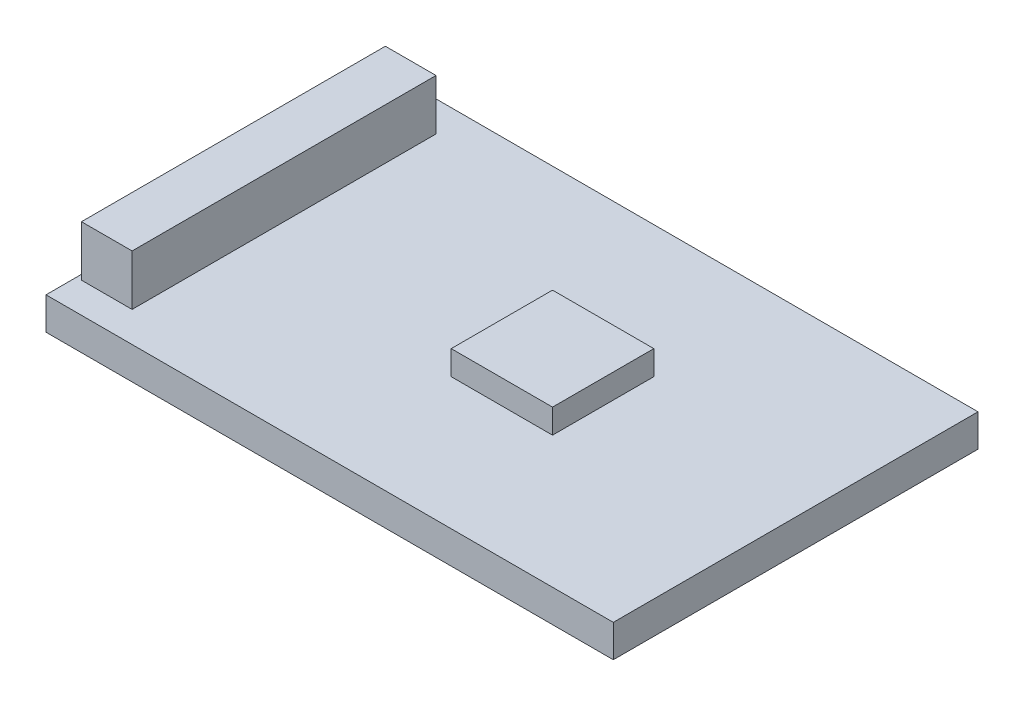
ISO-10303-21;
HEADER;
FILE_DESCRIPTION(('STEP AP214'),'2;1');
FILE_NAME('part.step','',(''),(''),'','','');
FILE_SCHEMA(('AUTOMOTIVE_DESIGN { 1 0 10303 214 1 1 1 1 }'));
ENDSEC;
DATA;
#1=APPLICATION_CONTEXT('core data for automotive mechanical design processes');
#2=APPLICATION_PROTOCOL_DEFINITION('international standard','automotive_design',2000,#1);
#3=PRODUCT_CONTEXT('',#1,'mechanical');
#4=PRODUCT('Part','Part','',(#3));
#5=PRODUCT_RELATED_PRODUCT_CATEGORY('part','',(#4));
#6=PRODUCT_DEFINITION_FORMATION('','',#4);
#7=PRODUCT_DEFINITION_CONTEXT('part definition',#1,'design');
#8=PRODUCT_DEFINITION('design','',#6,#7);
#9=PRODUCT_DEFINITION_SHAPE('','',#8);
#10=(LENGTH_UNIT() NAMED_UNIT(*) SI_UNIT(.MILLI.,.METRE.));
#11=(NAMED_UNIT(*) PLANE_ANGLE_UNIT() SI_UNIT($,.RADIAN.));
#12=(NAMED_UNIT(*) SI_UNIT($,.STERADIAN.) SOLID_ANGLE_UNIT());
#13=UNCERTAINTY_MEASURE_WITH_UNIT(LENGTH_MEASURE(1.E-05),#10,'distance_accuracy_value','');
#14=(GEOMETRIC_REPRESENTATION_CONTEXT(3) GLOBAL_UNCERTAINTY_ASSIGNED_CONTEXT((#13)) GLOBAL_UNIT_ASSIGNED_CONTEXT((#10,
#11,#12)) REPRESENTATION_CONTEXT('',''));
#15=CARTESIAN_POINT('',(0.,0.,0.));
#16=DIRECTION('',(0.,0.,1.));
#17=DIRECTION('',(1.,0.,0.));
#18=AXIS2_PLACEMENT_3D('',#15,#16,#17);
#19=CARTESIAN_POINT('',(0.,1.6,0.));
#20=DIRECTION('',(0.,-1.,0.));
#21=DIRECTION('',(0.,0.,-1.));
#22=AXIS2_PLACEMENT_3D('',#19,#20,#21);
#23=PLANE('',#22);
#24=DIRECTION('',(0.,0.,-1.));
#25=VECTOR('',#24,1.);
#26=CARTESIAN_POINT('',(4.5,1.6,2.5));
#27=LINE('',#26,#25);
#28=CARTESIAN_POINT('',(4.5,1.6,2.5));
#29=VERTEX_POINT('',#28);
#30=CARTESIAN_POINT('',(4.5,1.6,-2.5));
#31=VERTEX_POINT('',#30);
#32=EDGE_CURVE('E162',#29,#31,#27,.T.);
#33=ORIENTED_EDGE('',*,*,#32,.F.);
#34=DIRECTION('',(1.,0.,0.));
#35=VECTOR('',#34,1.);
#36=CARTESIAN_POINT('',(-0.5,1.6,2.5));
#37=LINE('',#36,#35);
#38=CARTESIAN_POINT('',(-0.5,1.6,2.5));
#39=VERTEX_POINT('',#38);
#40=EDGE_CURVE('E178',#39,#29,#37,.T.);
#41=ORIENTED_EDGE('',*,*,#40,.F.);
#42=DIRECTION('',(0.,0.,1.));
#43=VECTOR('',#42,1.);
#44=CARTESIAN_POINT('',(-0.5,1.6,2.5));
#45=LINE('',#44,#43);
#46=CARTESIAN_POINT('',(-0.5,1.6,-2.5));
#47=VERTEX_POINT('',#46);
#48=EDGE_CURVE('E192',#47,#39,#45,.T.);
#49=ORIENTED_EDGE('',*,*,#48,.F.);
#50=DIRECTION('',(-1.,0.,0.));
#51=VECTOR('',#50,1.);
#52=CARTESIAN_POINT('',(-0.5,1.6,-2.5));
#53=LINE('',#52,#51);
#54=EDGE_CURVE('E169',#31,#47,#53,.T.);
#55=ORIENTED_EDGE('',*,*,#54,.F.);
#56=EDGE_LOOP('',(#33,#41,#49,#55));
#57=FACE_BOUND('',#56,.T.);
#58=DIRECTION('',(0.,0.,-1.));
#59=VECTOR('',#58,1.);
#60=CARTESIAN_POINT('',(14.,1.6,9.));
#61=LINE('',#60,#59);
#62=CARTESIAN_POINT('',(14.,1.6,9.));
#63=VERTEX_POINT('',#62);
#64=CARTESIAN_POINT('',(14.,1.6,-9.));
#65=VERTEX_POINT('',#64);
#66=EDGE_CURVE('E214',#63,#65,#61,.T.);
#67=ORIENTED_EDGE('',*,*,#66,.T.);
#68=DIRECTION('',(-1.,0.,0.));
#69=VECTOR('',#68,1.);
#70=CARTESIAN_POINT('',(-14.,1.6,-9.));
#71=LINE('',#70,#69);
#72=CARTESIAN_POINT('',(-14.,1.6,-9.));
#73=VERTEX_POINT('',#72);
#74=EDGE_CURVE('E218',#65,#73,#71,.T.);
#75=ORIENTED_EDGE('',*,*,#74,.T.);
#76=DIRECTION('',(0.,0.,1.));
#77=VECTOR('',#76,1.);
#78=CARTESIAN_POINT('',(-14.,1.6,9.));
#79=LINE('',#78,#77);
#80=CARTESIAN_POINT('',(-14.,1.6,9.));
#81=VERTEX_POINT('',#80);
#82=EDGE_CURVE('E224',#73,#81,#79,.T.);
#83=ORIENTED_EDGE('',*,*,#82,.T.);
#84=DIRECTION('',(1.,0.,0.));
#85=VECTOR('',#84,1.);
#86=CARTESIAN_POINT('',(-14.,1.6,9.));
#87=LINE('',#86,#85);
#88=EDGE_CURVE('E226',#81,#63,#87,.T.);
#89=ORIENTED_EDGE('',*,*,#88,.T.);
#90=EDGE_LOOP('',(#67,#75,#83,#89));
#91=FACE_BOUND('',#90,.T.);
#92=DIRECTION('',(0.,0.,-1.));
#93=VECTOR('',#92,1.);
#94=CARTESIAN_POINT('',(-11.25,1.6,7.5));
#95=LINE('',#94,#93);
#96=CARTESIAN_POINT('',(-11.25,1.6,7.5));
#97=VERTEX_POINT('',#96);
#98=CARTESIAN_POINT('',(-11.25,1.6,-7.5));
#99=VERTEX_POINT('',#98);
#100=EDGE_CURVE('E161',#97,#99,#95,.T.);
#101=ORIENTED_EDGE('',*,*,#100,.F.);
#102=DIRECTION('',(1.,0.,0.));
#103=VECTOR('',#102,1.);
#104=CARTESIAN_POINT('',(-13.75,1.6,7.5));
#105=LINE('',#104,#103);
#106=CARTESIAN_POINT('',(-13.75,1.6,7.5));
#107=VERTEX_POINT('',#106);
#108=EDGE_CURVE('E158',#107,#97,#105,.T.);
#109=ORIENTED_EDGE('',*,*,#108,.F.);
#110=DIRECTION('',(0.,0.,1.));
#111=VECTOR('',#110,1.);
#112=CARTESIAN_POINT('',(-13.75,1.6,7.5));
#113=LINE('',#112,#111);
#114=CARTESIAN_POINT('',(-13.75,1.6,-7.5));
#115=VERTEX_POINT('',#114);
#116=EDGE_CURVE('E70',#115,#107,#113,.T.);
#117=ORIENTED_EDGE('',*,*,#116,.F.);
#118=DIRECTION('',(-1.,0.,0.));
#119=VECTOR('',#118,1.);
#120=CARTESIAN_POINT('',(-13.75,1.6,-7.5));
#121=LINE('',#120,#119);
#122=EDGE_CURVE('E64',#99,#115,#121,.T.);
#123=ORIENTED_EDGE('',*,*,#122,.F.);
#124=EDGE_LOOP('',(#101,#109,#117,#123));
#125=FACE_BOUND('',#124,.T.);
#126=ADVANCED_FACE('F47',(#57,#91,#125),#23,.F.);
#127=CARTESIAN_POINT('',(14.,1.6,9.));
#128=DIRECTION('',(-1.,0.,0.));
#129=DIRECTION('',(0.,0.,1.));
#130=AXIS2_PLACEMENT_3D('',#127,#128,#129);
#131=PLANE('',#130);
#132=DIRECTION('',(0.,0.,-1.));
#133=VECTOR('',#132,1.);
#134=CARTESIAN_POINT('',(14.,0.,9.));
#135=LINE('',#134,#133);
#136=CARTESIAN_POINT('',(14.,0.,9.));
#137=VERTEX_POINT('',#136);
#138=CARTESIAN_POINT('',(14.,0.,-9.));
#139=VERTEX_POINT('',#138);
#140=EDGE_CURVE('E212',#137,#139,#135,.T.);
#141=ORIENTED_EDGE('',*,*,#140,.T.);
#142=DIRECTION('',(0.,-1.,0.));
#143=VECTOR('',#142,1.);
#144=CARTESIAN_POINT('',(14.,1.6,-9.));
#145=LINE('',#144,#143);
#146=EDGE_CURVE('E11',#65,#139,#145,.T.);
#147=ORIENTED_EDGE('',*,*,#146,.F.);
#148=ORIENTED_EDGE('',*,*,#66,.F.);
#149=DIRECTION('',(0.,-1.,0.));
#150=VECTOR('',#149,1.);
#151=CARTESIAN_POINT('',(14.,1.6,9.));
#152=LINE('',#151,#150);
#153=EDGE_CURVE('E228',#63,#137,#152,.T.);
#154=ORIENTED_EDGE('',*,*,#153,.T.);
#155=EDGE_LOOP('',(#141,#147,#148,#154));
#156=FACE_BOUND('',#155,.T.);
#157=ADVANCED_FACE('F51',(#156),#131,.F.);
#158=CARTESIAN_POINT('',(-14.,1.6,-9.));
#159=DIRECTION('',(0.,0.,1.));
#160=DIRECTION('',(1.,0.,0.));
#161=AXIS2_PLACEMENT_3D('',#158,#159,#160);
#162=PLANE('',#161);
#163=DIRECTION('',(-1.,0.,0.));
#164=VECTOR('',#163,1.);
#165=CARTESIAN_POINT('',(-14.,0.,-9.));
#166=LINE('',#165,#164);
#167=CARTESIAN_POINT('',(-14.,0.,-9.));
#168=VERTEX_POINT('',#167);
#169=EDGE_CURVE('E234',#139,#168,#166,.T.);
#170=ORIENTED_EDGE('',*,*,#169,.T.);
#171=DIRECTION('',(0.,-1.,0.));
#172=VECTOR('',#171,1.);
#173=CARTESIAN_POINT('',(-14.,1.6,-9.));
#174=LINE('',#173,#172);
#175=EDGE_CURVE('E59',#73,#168,#174,.T.);
#176=ORIENTED_EDGE('',*,*,#175,.F.);
#177=ORIENTED_EDGE('',*,*,#74,.F.);
#178=ORIENTED_EDGE('',*,*,#146,.T.);
#179=EDGE_LOOP('',(#170,#176,#177,#178));
#180=FACE_BOUND('',#179,.T.);
#181=ADVANCED_FACE('F268',(#180),#162,.F.);
#182=CARTESIAN_POINT('',(-14.,1.6,9.));
#183=DIRECTION('',(1.,0.,0.));
#184=DIRECTION('',(0.,0.,-1.));
#185=AXIS2_PLACEMENT_3D('',#182,#183,#184);
#186=PLANE('',#185);
#187=DIRECTION('',(0.,0.,1.));
#188=VECTOR('',#187,1.);
#189=CARTESIAN_POINT('',(-14.,0.,9.));
#190=LINE('',#189,#188);
#191=CARTESIAN_POINT('',(-14.,0.,9.));
#192=VERTEX_POINT('',#191);
#193=EDGE_CURVE('E237',#168,#192,#190,.T.);
#194=ORIENTED_EDGE('',*,*,#193,.T.);
#195=DIRECTION('',(0.,-1.,0.));
#196=VECTOR('',#195,1.);
#197=CARTESIAN_POINT('',(-14.,1.6,9.));
#198=LINE('',#197,#196);
#199=EDGE_CURVE('E243',#81,#192,#198,.T.);
#200=ORIENTED_EDGE('',*,*,#199,.F.);
#201=ORIENTED_EDGE('',*,*,#82,.F.);
#202=ORIENTED_EDGE('',*,*,#175,.T.);
#203=EDGE_LOOP('',(#194,#200,#201,#202));
#204=FACE_BOUND('',#203,.T.);
#205=ADVANCED_FACE('F251',(#204),#186,.F.);
#206=CARTESIAN_POINT('',(-14.,1.6,9.));
#207=DIRECTION('',(0.,0.,-1.));
#208=DIRECTION('',(-1.,0.,0.));
#209=AXIS2_PLACEMENT_3D('',#206,#207,#208);
#210=PLANE('',#209);
#211=DIRECTION('',(1.,0.,0.));
#212=VECTOR('',#211,1.);
#213=CARTESIAN_POINT('',(-14.,0.,9.));
#214=LINE('',#213,#212);
#215=EDGE_CURVE('E219',#192,#137,#214,.T.);
#216=ORIENTED_EDGE('',*,*,#215,.T.);
#217=ORIENTED_EDGE('',*,*,#153,.F.);
#218=ORIENTED_EDGE('',*,*,#88,.F.);
#219=ORIENTED_EDGE('',*,*,#199,.T.);
#220=EDGE_LOOP('',(#216,#217,#218,#219));
#221=FACE_BOUND('',#220,.T.);
#222=ADVANCED_FACE('F265',(#221),#210,.F.);
#223=CARTESIAN_POINT('',(0.,0.,0.));
#224=DIRECTION('',(0.,-1.,0.));
#225=DIRECTION('',(0.,0.,-1.));
#226=AXIS2_PLACEMENT_3D('',#223,#224,#225);
#227=PLANE('',#226);
#228=ORIENTED_EDGE('',*,*,#140,.F.);
#229=ORIENTED_EDGE('',*,*,#215,.F.);
#230=ORIENTED_EDGE('',*,*,#193,.F.);
#231=ORIENTED_EDGE('',*,*,#169,.F.);
#232=EDGE_LOOP('',(#228,#229,#230,#231));
#233=FACE_BOUND('',#232,.T.);
#234=ADVANCED_FACE('F259',(#233),#227,.T.);
#235=CARTESIAN_POINT('',(4.5,2.8,2.5));
#236=DIRECTION('',(-1.,0.,0.));
#237=DIRECTION('',(0.,0.,1.));
#238=AXIS2_PLACEMENT_3D('',#235,#236,#237);
#239=PLANE('',#238);
#240=ORIENTED_EDGE('',*,*,#32,.T.);
#241=DIRECTION('',(0.,-1.,0.));
#242=VECTOR('',#241,1.);
#243=CARTESIAN_POINT('',(4.5,2.8,-2.5));
#244=LINE('',#243,#242);
#245=CARTESIAN_POINT('',(4.5,2.8,-2.5));
#246=VERTEX_POINT('',#245);
#247=EDGE_CURVE('E209',#246,#31,#244,.T.);
#248=ORIENTED_EDGE('',*,*,#247,.F.);
#249=DIRECTION('',(0.,0.,-1.));
#250=VECTOR('',#249,1.);
#251=CARTESIAN_POINT('',(4.5,2.8,2.5));
#252=LINE('',#251,#250);
#253=CARTESIAN_POINT('',(4.5,2.8,2.5));
#254=VERTEX_POINT('',#253);
#255=EDGE_CURVE('E173',#254,#246,#252,.T.);
#256=ORIENTED_EDGE('',*,*,#255,.F.);
#257=DIRECTION('',(0.,-1.,0.));
#258=VECTOR('',#257,1.);
#259=CARTESIAN_POINT('',(4.5,2.8,2.5));
#260=LINE('',#259,#258);
#261=EDGE_CURVE('E190',#254,#29,#260,.T.);
#262=ORIENTED_EDGE('',*,*,#261,.T.);
#263=EDGE_LOOP('',(#240,#248,#256,#262));
#264=FACE_BOUND('',#263,.T.);
#265=ADVANCED_FACE('F283',(#264),#239,.F.);
#266=CARTESIAN_POINT('',(-0.5,2.8,-2.5));
#267=DIRECTION('',(0.,0.,1.));
#268=DIRECTION('',(1.,0.,0.));
#269=AXIS2_PLACEMENT_3D('',#266,#267,#268);
#270=PLANE('',#269);
#271=ORIENTED_EDGE('',*,*,#54,.T.);
#272=DIRECTION('',(0.,-1.,0.));
#273=VECTOR('',#272,1.);
#274=CARTESIAN_POINT('',(-0.5,2.8,-2.5));
#275=LINE('',#274,#273);
#276=CARTESIAN_POINT('',(-0.5,2.8,-2.5));
#277=VERTEX_POINT('',#276);
#278=EDGE_CURVE('E206',#277,#47,#275,.T.);
#279=ORIENTED_EDGE('',*,*,#278,.F.);
#280=DIRECTION('',(-1.,0.,0.));
#281=VECTOR('',#280,1.);
#282=CARTESIAN_POINT('',(-0.5,2.8,-2.5));
#283=LINE('',#282,#281);
#284=EDGE_CURVE('E179',#246,#277,#283,.T.);
#285=ORIENTED_EDGE('',*,*,#284,.F.);
#286=ORIENTED_EDGE('',*,*,#247,.T.);
#287=EDGE_LOOP('',(#271,#279,#285,#286));
#288=FACE_BOUND('',#287,.T.);
#289=ADVANCED_FACE('F307',(#288),#270,.F.);
#290=CARTESIAN_POINT('',(-0.5,2.8,2.5));
#291=DIRECTION('',(1.,0.,0.));
#292=DIRECTION('',(0.,0.,-1.));
#293=AXIS2_PLACEMENT_3D('',#290,#291,#292);
#294=PLANE('',#293);
#295=ORIENTED_EDGE('',*,*,#48,.T.);
#296=DIRECTION('',(0.,-1.,0.));
#297=VECTOR('',#296,1.);
#298=CARTESIAN_POINT('',(-0.5,2.8,2.5));
#299=LINE('',#298,#297);
#300=CARTESIAN_POINT('',(-0.5,2.8,2.5));
#301=VERTEX_POINT('',#300);
#302=EDGE_CURVE('E205',#301,#39,#299,.T.);
#303=ORIENTED_EDGE('',*,*,#302,.F.);
#304=DIRECTION('',(0.,0.,1.));
#305=VECTOR('',#304,1.);
#306=CARTESIAN_POINT('',(-0.5,2.8,2.5));
#307=LINE('',#306,#305);
#308=EDGE_CURVE('E185',#277,#301,#307,.T.);
#309=ORIENTED_EDGE('',*,*,#308,.F.);
#310=ORIENTED_EDGE('',*,*,#278,.T.);
#311=EDGE_LOOP('',(#295,#303,#309,#310));
#312=FACE_BOUND('',#311,.T.);
#313=ADVANCED_FACE('F318',(#312),#294,.F.);
#314=CARTESIAN_POINT('',(-0.5,2.8,2.5));
#315=DIRECTION('',(0.,0.,-1.));
#316=DIRECTION('',(-1.,0.,0.));
#317=AXIS2_PLACEMENT_3D('',#314,#315,#316);
#318=PLANE('',#317);
#319=ORIENTED_EDGE('',*,*,#40,.T.);
#320=ORIENTED_EDGE('',*,*,#261,.F.);
#321=DIRECTION('',(1.,0.,0.));
#322=VECTOR('',#321,1.);
#323=CARTESIAN_POINT('',(-0.5,2.8,2.5));
#324=LINE('',#323,#322);
#325=EDGE_CURVE('E183',#301,#254,#324,.T.);
#326=ORIENTED_EDGE('',*,*,#325,.F.);
#327=ORIENTED_EDGE('',*,*,#302,.T.);
#328=EDGE_LOOP('',(#319,#320,#326,#327));
#329=FACE_BOUND('',#328,.T.);
#330=ADVANCED_FACE('F328',(#329),#318,.F.);
#331=CARTESIAN_POINT('',(0.,2.8,0.));
#332=DIRECTION('',(0.,-1.,0.));
#333=DIRECTION('',(0.,0.,-1.));
#334=AXIS2_PLACEMENT_3D('',#331,#332,#333);
#335=PLANE('',#334);
#336=ORIENTED_EDGE('',*,*,#255,.T.);
#337=ORIENTED_EDGE('',*,*,#284,.T.);
#338=ORIENTED_EDGE('',*,*,#308,.T.);
#339=ORIENTED_EDGE('',*,*,#325,.T.);
#340=EDGE_LOOP('',(#336,#337,#338,#339));
#341=FACE_BOUND('',#340,.T.);
#342=ADVANCED_FACE('F339',(#341),#335,.F.);
#343=CARTESIAN_POINT('',(-11.25,4.1,7.5));
#344=DIRECTION('',(-1.,0.,0.));
#345=DIRECTION('',(0.,0.,1.));
#346=AXIS2_PLACEMENT_3D('',#343,#344,#345);
#347=PLANE('',#346);
#348=ORIENTED_EDGE('',*,*,#100,.T.);
#349=DIRECTION('',(0.,-1.,0.));
#350=VECTOR('',#349,1.);
#351=CARTESIAN_POINT('',(-11.25,4.1,-7.5));
#352=LINE('',#351,#350);
#353=CARTESIAN_POINT('',(-11.25,4.1,-7.5));
#354=VERTEX_POINT('',#353);
#355=EDGE_CURVE('E140',#354,#99,#352,.T.);
#356=ORIENTED_EDGE('',*,*,#355,.F.);
#357=DIRECTION('',(0.,0.,-1.));
#358=VECTOR('',#357,1.);
#359=CARTESIAN_POINT('',(-11.25,4.1,7.5));
#360=LINE('',#359,#358);
#361=CARTESIAN_POINT('',(-11.25,4.1,7.5));
#362=VERTEX_POINT('',#361);
#363=EDGE_CURVE('E146',#362,#354,#360,.T.);
#364=ORIENTED_EDGE('',*,*,#363,.F.);
#365=DIRECTION('',(0.,-1.,0.));
#366=VECTOR('',#365,1.);
#367=CARTESIAN_POINT('',(-11.25,4.1,7.5));
#368=LINE('',#367,#366);
#369=EDGE_CURVE('E447',#362,#97,#368,.T.);
#370=ORIENTED_EDGE('',*,*,#369,.T.);
#371=EDGE_LOOP('',(#348,#356,#364,#370));
#372=FACE_BOUND('',#371,.T.);
#373=ADVANCED_FACE('F159',(#372),#347,.F.);
#374=CARTESIAN_POINT('',(-13.75,4.1,-7.5));
#375=DIRECTION('',(0.,0.,1.));
#376=DIRECTION('',(1.,0.,0.));
#377=AXIS2_PLACEMENT_3D('',#374,#375,#376);
#378=PLANE('',#377);
#379=ORIENTED_EDGE('',*,*,#122,.T.);
#380=DIRECTION('',(0.,-1.,0.));
#381=VECTOR('',#380,1.);
#382=CARTESIAN_POINT('',(-13.75,4.1,-7.5));
#383=LINE('',#382,#381);
#384=CARTESIAN_POINT('',(-13.75,4.1,-7.5));
#385=VERTEX_POINT('',#384);
#386=EDGE_CURVE('E141',#385,#115,#383,.T.);
#387=ORIENTED_EDGE('',*,*,#386,.F.);
#388=DIRECTION('',(-1.,0.,0.));
#389=VECTOR('',#388,1.);
#390=CARTESIAN_POINT('',(-13.75,4.1,-7.5));
#391=LINE('',#390,#389);
#392=EDGE_CURVE('E136',#354,#385,#391,.T.);
#393=ORIENTED_EDGE('',*,*,#392,.F.);
#394=ORIENTED_EDGE('',*,*,#355,.T.);
#395=EDGE_LOOP('',(#379,#387,#393,#394));
#396=FACE_BOUND('',#395,.T.);
#397=ADVANCED_FACE('F139',(#396),#378,.F.);
#398=CARTESIAN_POINT('',(-13.75,4.1,7.5));
#399=DIRECTION('',(1.,0.,0.));
#400=DIRECTION('',(0.,0.,-1.));
#401=AXIS2_PLACEMENT_3D('',#398,#399,#400);
#402=PLANE('',#401);
#403=ORIENTED_EDGE('',*,*,#116,.T.);
#404=DIRECTION('',(0.,-1.,0.));
#405=VECTOR('',#404,1.);
#406=CARTESIAN_POINT('',(-13.75,4.1,7.5));
#407=LINE('',#406,#405);
#408=CARTESIAN_POINT('',(-13.75,4.1,7.5));
#409=VERTEX_POINT('',#408);
#410=EDGE_CURVE('E168',#409,#107,#407,.T.);
#411=ORIENTED_EDGE('',*,*,#410,.F.);
#412=DIRECTION('',(0.,0.,1.));
#413=VECTOR('',#412,1.);
#414=CARTESIAN_POINT('',(-13.75,4.1,7.5));
#415=LINE('',#414,#413);
#416=EDGE_CURVE('E150',#385,#409,#415,.T.);
#417=ORIENTED_EDGE('',*,*,#416,.F.);
#418=ORIENTED_EDGE('',*,*,#386,.T.);
#419=EDGE_LOOP('',(#403,#411,#417,#418));
#420=FACE_BOUND('',#419,.T.);
#421=ADVANCED_FACE('F367',(#420),#402,.F.);
#422=CARTESIAN_POINT('',(-13.75,4.1,7.5));
#423=DIRECTION('',(0.,0.,-1.));
#424=DIRECTION('',(-1.,0.,0.));
#425=AXIS2_PLACEMENT_3D('',#422,#423,#424);
#426=PLANE('',#425);
#427=ORIENTED_EDGE('',*,*,#108,.T.);
#428=ORIENTED_EDGE('',*,*,#369,.F.);
#429=DIRECTION('',(1.,0.,0.));
#430=VECTOR('',#429,1.);
#431=CARTESIAN_POINT('',(-13.75,4.1,7.5));
#432=LINE('',#431,#430);
#433=EDGE_CURVE('E153',#409,#362,#432,.T.);
#434=ORIENTED_EDGE('',*,*,#433,.F.);
#435=ORIENTED_EDGE('',*,*,#410,.T.);
#436=EDGE_LOOP('',(#427,#428,#434,#435));
#437=FACE_BOUND('',#436,.T.);
#438=ADVANCED_FACE('F377',(#437),#426,.F.);
#439=CARTESIAN_POINT('',(0.,4.1,0.));
#440=DIRECTION('',(0.,-1.,0.));
#441=DIRECTION('',(0.,0.,-1.));
#442=AXIS2_PLACEMENT_3D('',#439,#440,#441);
#443=PLANE('',#442);
#444=ORIENTED_EDGE('',*,*,#363,.T.);
#445=ORIENTED_EDGE('',*,*,#392,.T.);
#446=ORIENTED_EDGE('',*,*,#416,.T.);
#447=ORIENTED_EDGE('',*,*,#433,.T.);
#448=EDGE_LOOP('',(#444,#445,#446,#447));
#449=FACE_BOUND('',#448,.T.);
#450=ADVANCED_FACE('F151',(#449),#443,.F.);
#451=CLOSED_SHELL('',(#126,#157,#181,#205,#222,#234,#265,#289,#313,#330,#342,#373,#397,#421,
#438,#450));
#452=MANIFOLD_SOLID_BREP('B2',#451);
#453=ADVANCED_BREP_SHAPE_REPRESENTATION('',(#18,#452),#14);
#454=SHAPE_DEFINITION_REPRESENTATION(#9,#453);
ENDSEC;
END-ISO-10303-21;
